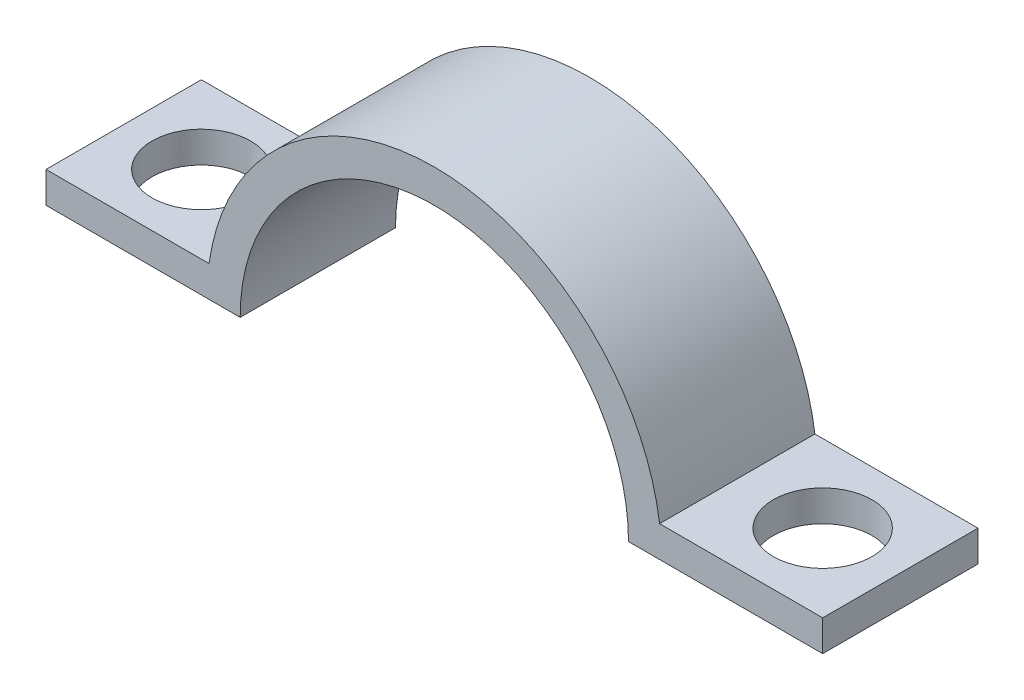
ISO-10303-21;
HEADER;
FILE_DESCRIPTION(('STEP AP214'),'2;1');
FILE_NAME('part.step','',(''),(''),'','','');
FILE_SCHEMA(('AUTOMOTIVE_DESIGN { 1 0 10303 214 1 1 1 1 }'));
ENDSEC;
DATA;
#1=APPLICATION_CONTEXT('core data for automotive mechanical design processes');
#2=APPLICATION_PROTOCOL_DEFINITION('international standard','automotive_design',2000,#1);
#3=PRODUCT_CONTEXT('',#1,'mechanical');
#4=PRODUCT('Part','Part','',(#3));
#5=PRODUCT_RELATED_PRODUCT_CATEGORY('part','',(#4));
#6=PRODUCT_DEFINITION_FORMATION('','',#4);
#7=PRODUCT_DEFINITION_CONTEXT('part definition',#1,'design');
#8=PRODUCT_DEFINITION('design','',#6,#7);
#9=PRODUCT_DEFINITION_SHAPE('','',#8);
#10=(LENGTH_UNIT() NAMED_UNIT(*) SI_UNIT(.MILLI.,.METRE.));
#11=(NAMED_UNIT(*) PLANE_ANGLE_UNIT() SI_UNIT($,.RADIAN.));
#12=(NAMED_UNIT(*) SI_UNIT($,.STERADIAN.) SOLID_ANGLE_UNIT());
#13=UNCERTAINTY_MEASURE_WITH_UNIT(LENGTH_MEASURE(1.E-05),#10,'distance_accuracy_value','');
#14=(GEOMETRIC_REPRESENTATION_CONTEXT(3) GLOBAL_UNCERTAINTY_ASSIGNED_CONTEXT((#13)) GLOBAL_UNIT_ASSIGNED_CONTEXT((#10,
#11,#12)) REPRESENTATION_CONTEXT('',''));
#15=CARTESIAN_POINT('',(0.,0.,0.));
#16=DIRECTION('',(0.,0.,1.));
#17=DIRECTION('',(1.,0.,0.));
#18=AXIS2_PLACEMENT_3D('',#15,#16,#17);
#19=CARTESIAN_POINT('',(-66.7458652227116,0.,40.));
#20=DIRECTION('',(0.,1.,0.));
#21=DIRECTION('',(0.,0.,1.));
#22=AXIS2_PLACEMENT_3D('',#19,#20,#21);
#23=PLANE('',#22);
#24=CARTESIAN_POINT('',(-46.7458652227116,0.,20.));
#25=DIRECTION('',(0.,1.,0.));
#26=DIRECTION('',(0.,0.,1.));
#27=AXIS2_PLACEMENT_3D('',#24,#25,#26);
#28=CIRCLE('',#27,12.7);
#29=CARTESIAN_POINT('',(-46.7458652227116,0.,32.7));
#30=VERTEX_POINT('',#29);
#31=EDGE_CURVE('E185',#30,#30,#28,.T.);
#32=ORIENTED_EDGE('',*,*,#31,.T.);
#33=EDGE_LOOP('',(#32));
#34=FACE_BOUND('',#33,.T.);
#35=DIRECTION('',(1.,0.,0.));
#36=VECTOR('',#35,1.);
#37=CARTESIAN_POINT('',(-66.7458652227116,0.,0.));
#38=LINE('',#37,#36);
#39=CARTESIAN_POINT('',(-66.7458652227116,0.,0.));
#40=VERTEX_POINT('',#39);
#41=CARTESIAN_POINT('',(-16.7458652227117,0.,0.));
#42=VERTEX_POINT('',#41);
#43=EDGE_CURVE('E135',#40,#42,#38,.T.);
#44=ORIENTED_EDGE('',*,*,#43,.T.);
#45=DIRECTION('',(0.,0.,-1.));
#46=VECTOR('',#45,1.);
#47=CARTESIAN_POINT('',(-16.7458652227117,0.,40.));
#48=LINE('',#47,#46);
#49=CARTESIAN_POINT('',(-16.7458652227117,0.,40.));
#50=VERTEX_POINT('',#49);
#51=EDGE_CURVE('E11',#50,#42,#48,.T.);
#52=ORIENTED_EDGE('',*,*,#51,.F.);
#53=DIRECTION('',(1.,0.,0.));
#54=VECTOR('',#53,1.);
#55=CARTESIAN_POINT('',(-66.7458652227116,0.,40.));
#56=LINE('',#55,#54);
#57=CARTESIAN_POINT('',(-66.7458652227116,0.,40.));
#58=VERTEX_POINT('',#57);
#59=EDGE_CURVE('E150',#58,#50,#56,.T.);
#60=ORIENTED_EDGE('',*,*,#59,.F.);
#61=DIRECTION('',(0.,0.,-1.));
#62=VECTOR('',#61,1.);
#63=CARTESIAN_POINT('',(-66.7458652227116,0.,40.));
#64=LINE('',#63,#62);
#65=EDGE_CURVE('E131',#58,#40,#64,.T.);
#66=ORIENTED_EDGE('',*,*,#65,.T.);
#67=EDGE_LOOP('',(#44,#52,#60,#66));
#68=FACE_BOUND('',#67,.T.);
#69=ADVANCED_FACE('F39',(#34,#68),#23,.F.);
#70=CARTESIAN_POINT('',(33.2541347772884,0.,40.));
#71=DIRECTION('',(0.,0.,-1.));
#72=DIRECTION('',(-1.,0.,0.));
#73=AXIS2_PLACEMENT_3D('',#70,#71,#72);
#74=CYLINDRICAL_SURFACE('',#73,50.);
#75=CARTESIAN_POINT('',(33.2541347772884,0.,0.));
#76=DIRECTION('',(0.,0.,-1.));
#77=DIRECTION('',(1.,0.,0.));
#78=AXIS2_PLACEMENT_3D('',#75,#76,#77);
#79=CIRCLE('',#78,50.);
#80=CARTESIAN_POINT('',(83.2541347772884,0.,0.));
#81=VERTEX_POINT('',#80);
#82=EDGE_CURVE('E138',#42,#81,#79,.T.);
#83=ORIENTED_EDGE('',*,*,#82,.T.);
#84=DIRECTION('',(0.,0.,-1.));
#85=VECTOR('',#84,1.);
#86=CARTESIAN_POINT('',(83.2541347772884,0.,40.));
#87=LINE('',#86,#85);
#88=CARTESIAN_POINT('',(83.2541347772884,0.,40.));
#89=VERTEX_POINT('',#88);
#90=EDGE_CURVE('E47',#89,#81,#87,.T.);
#91=ORIENTED_EDGE('',*,*,#90,.F.);
#92=CARTESIAN_POINT('',(33.2541347772884,0.,40.));
#93=DIRECTION('',(0.,0.,-1.));
#94=DIRECTION('',(1.,0.,0.));
#95=AXIS2_PLACEMENT_3D('',#92,#93,#94);
#96=CIRCLE('',#95,50.);
#97=EDGE_CURVE('E98',#50,#89,#96,.T.);
#98=ORIENTED_EDGE('',*,*,#97,.F.);
#99=ORIENTED_EDGE('',*,*,#51,.T.);
#100=EDGE_LOOP('',(#83,#91,#98,#99));
#101=FACE_BOUND('',#100,.T.);
#102=ADVANCED_FACE('F208',(#101),#74,.F.);
#103=CARTESIAN_POINT('',(83.2541347772884,0.,40.));
#104=DIRECTION('',(0.,1.,0.));
#105=DIRECTION('',(0.,0.,1.));
#106=AXIS2_PLACEMENT_3D('',#103,#104,#105);
#107=PLANE('',#106);
#108=CARTESIAN_POINT('',(113.254134777288,0.,20.));
#109=DIRECTION('',(0.,1.,0.));
#110=DIRECTION('',(0.,0.,1.));
#111=AXIS2_PLACEMENT_3D('',#108,#109,#110);
#112=CIRCLE('',#111,12.7);
#113=CARTESIAN_POINT('',(113.254134777288,0.,32.7));
#114=VERTEX_POINT('',#113);
#115=EDGE_CURVE('E139',#114,#114,#112,.T.);
#116=ORIENTED_EDGE('',*,*,#115,.T.);
#117=EDGE_LOOP('',(#116));
#118=FACE_BOUND('',#117,.T.);
#119=DIRECTION('',(1.,0.,0.));
#120=VECTOR('',#119,1.);
#121=CARTESIAN_POINT('',(83.2541347772884,0.,0.));
#122=LINE('',#121,#120);
#123=CARTESIAN_POINT('',(133.254134777288,0.,0.));
#124=VERTEX_POINT('',#123);
#125=EDGE_CURVE('E141',#81,#124,#122,.T.);
#126=ORIENTED_EDGE('',*,*,#125,.T.);
#127=DIRECTION('',(0.,0.,-1.));
#128=VECTOR('',#127,1.);
#129=CARTESIAN_POINT('',(133.254134777288,0.,40.));
#130=LINE('',#129,#128);
#131=CARTESIAN_POINT('',(133.254134777288,0.,40.));
#132=VERTEX_POINT('',#131);
#133=EDGE_CURVE('E157',#132,#124,#130,.T.);
#134=ORIENTED_EDGE('',*,*,#133,.F.);
#135=DIRECTION('',(1.,0.,0.));
#136=VECTOR('',#135,1.);
#137=CARTESIAN_POINT('',(83.2541347772884,0.,40.));
#138=LINE('',#137,#136);
#139=EDGE_CURVE('E165',#89,#132,#138,.T.);
#140=ORIENTED_EDGE('',*,*,#139,.F.);
#141=ORIENTED_EDGE('',*,*,#90,.T.);
#142=EDGE_LOOP('',(#126,#134,#140,#141));
#143=FACE_BOUND('',#142,.T.);
#144=ADVANCED_FACE('F163',(#118,#143),#107,.F.);
#145=CARTESIAN_POINT('',(133.254134777288,0.,40.));
#146=DIRECTION('',(-1.,0.,0.));
#147=DIRECTION('',(0.,0.,1.));
#148=AXIS2_PLACEMENT_3D('',#145,#146,#147);
#149=PLANE('',#148);
#150=DIRECTION('',(0.,1.,0.));
#151=VECTOR('',#150,1.);
#152=CARTESIAN_POINT('',(133.254134777288,0.,0.));
#153=LINE('',#152,#151);
#154=CARTESIAN_POINT('',(133.254134777288,8.,0.));
#155=VERTEX_POINT('',#154);
#156=EDGE_CURVE('E143',#124,#155,#153,.T.);
#157=ORIENTED_EDGE('',*,*,#156,.T.);
#158=DIRECTION('',(0.,0.,-1.));
#159=VECTOR('',#158,1.);
#160=CARTESIAN_POINT('',(133.254134777288,8.,40.));
#161=LINE('',#160,#159);
#162=CARTESIAN_POINT('',(133.254134777288,8.,40.));
#163=VERTEX_POINT('',#162);
#164=EDGE_CURVE('E154',#163,#155,#161,.T.);
#165=ORIENTED_EDGE('',*,*,#164,.F.);
#166=DIRECTION('',(0.,1.,0.));
#167=VECTOR('',#166,1.);
#168=CARTESIAN_POINT('',(133.254134777288,0.,40.));
#169=LINE('',#168,#167);
#170=EDGE_CURVE('E177',#132,#163,#169,.T.);
#171=ORIENTED_EDGE('',*,*,#170,.F.);
#172=ORIENTED_EDGE('',*,*,#133,.T.);
#173=EDGE_LOOP('',(#157,#165,#171,#172));
#174=FACE_BOUND('',#173,.T.);
#175=ADVANCED_FACE('F173',(#174),#149,.F.);
#176=CARTESIAN_POINT('',(133.254134777288,8.,40.));
#177=DIRECTION('',(0.,-1.,0.));
#178=DIRECTION('',(0.,0.,-1.));
#179=AXIS2_PLACEMENT_3D('',#176,#177,#178);
#180=PLANE('',#179);
#181=CARTESIAN_POINT('',(113.254134777288,7.99999999999999,20.));
#182=DIRECTION('',(0.,1.,0.));
#183=DIRECTION('',(-1.,0.,0.));
#184=AXIS2_PLACEMENT_3D('',#181,#182,#183);
#185=CIRCLE('',#184,12.7);
#186=CARTESIAN_POINT('',(100.554134777288,7.99999999999999,20.));
#187=VERTEX_POINT('',#186);
#188=EDGE_CURVE('E189',#187,#187,#185,.T.);
#189=ORIENTED_EDGE('',*,*,#188,.F.);
#190=EDGE_LOOP('',(#189));
#191=FACE_BOUND('',#190,.T.);
#192=DIRECTION('',(-1.,0.,0.));
#193=VECTOR('',#192,1.);
#194=CARTESIAN_POINT('',(133.254134777288,8.,0.));
#195=LINE('',#194,#193);
#196=CARTESIAN_POINT('',(91.2541347772884,8.,0.));
#197=VERTEX_POINT('',#196);
#198=EDGE_CURVE('E145',#155,#197,#195,.T.);
#199=ORIENTED_EDGE('',*,*,#198,.T.);
#200=DIRECTION('',(0.,0.,-1.));
#201=VECTOR('',#200,1.);
#202=CARTESIAN_POINT('',(91.2541347772884,8.,40.));
#203=LINE('',#202,#201);
#204=CARTESIAN_POINT('',(91.2541347772884,8.,40.));
#205=VERTEX_POINT('',#204);
#206=EDGE_CURVE('E126',#205,#197,#203,.T.);
#207=ORIENTED_EDGE('',*,*,#206,.F.);
#208=DIRECTION('',(-1.,0.,0.));
#209=VECTOR('',#208,1.);
#210=CARTESIAN_POINT('',(133.254134777288,8.,40.));
#211=LINE('',#210,#209);
#212=EDGE_CURVE('E117',#163,#205,#211,.T.);
#213=ORIENTED_EDGE('',*,*,#212,.F.);
#214=ORIENTED_EDGE('',*,*,#164,.T.);
#215=EDGE_LOOP('',(#199,#207,#213,#214));
#216=FACE_BOUND('',#215,.T.);
#217=ADVANCED_FACE('F176',(#191,#216),#180,.F.);
#218=CARTESIAN_POINT('',(33.2541347772884,0.,40.));
#219=DIRECTION('',(0.,0.,-1.));
#220=DIRECTION('',(-1.,0.,0.));
#221=AXIS2_PLACEMENT_3D('',#218,#219,#220);
#222=CYLINDRICAL_SURFACE('',#221,58.5491246732178);
#223=CARTESIAN_POINT('',(33.2541347772884,0.,0.));
#224=DIRECTION('',(0.,0.,1.));
#225=DIRECTION('',(1.,0.,0.));
#226=AXIS2_PLACEMENT_3D('',#223,#224,#225);
#227=CIRCLE('',#226,58.5491246732178);
#228=CARTESIAN_POINT('',(-24.7458652227116,8.,0.));
#229=VERTEX_POINT('',#228);
#230=EDGE_CURVE('E125',#197,#229,#227,.T.);
#231=ORIENTED_EDGE('',*,*,#230,.T.);
#232=DIRECTION('',(0.,0.,-1.));
#233=VECTOR('',#232,1.);
#234=CARTESIAN_POINT('',(-24.7458652227116,8.,40.));
#235=LINE('',#234,#233);
#236=CARTESIAN_POINT('',(-24.7458652227116,8.,40.));
#237=VERTEX_POINT('',#236);
#238=EDGE_CURVE('E122',#237,#229,#235,.T.);
#239=ORIENTED_EDGE('',*,*,#238,.F.);
#240=CARTESIAN_POINT('',(33.2541347772884,0.,40.));
#241=DIRECTION('',(0.,0.,1.));
#242=DIRECTION('',(1.,0.,0.));
#243=AXIS2_PLACEMENT_3D('',#240,#241,#242);
#244=CIRCLE('',#243,58.5491246732178);
#245=EDGE_CURVE('E111',#205,#237,#244,.T.);
#246=ORIENTED_EDGE('',*,*,#245,.F.);
#247=ORIENTED_EDGE('',*,*,#206,.T.);
#248=EDGE_LOOP('',(#231,#239,#246,#247));
#249=FACE_BOUND('',#248,.T.);
#250=ADVANCED_FACE('F123',(#249),#222,.T.);
#251=CARTESIAN_POINT('',(-66.7458652227116,8.,40.));
#252=DIRECTION('',(0.,-1.,0.));
#253=DIRECTION('',(1.,0.,0.));
#254=AXIS2_PLACEMENT_3D('',#251,#252,#253);
#255=PLANE('',#254);
#256=CARTESIAN_POINT('',(-46.7458652227116,8.,20.));
#257=DIRECTION('',(0.,1.,0.));
#258=DIRECTION('',(-1.,0.,0.));
#259=AXIS2_PLACEMENT_3D('',#256,#257,#258);
#260=CIRCLE('',#259,12.7);
#261=CARTESIAN_POINT('',(-59.4458652227116,8.,20.));
#262=VERTEX_POINT('',#261);
#263=EDGE_CURVE('E188',#262,#262,#260,.T.);
#264=ORIENTED_EDGE('',*,*,#263,.F.);
#265=EDGE_LOOP('',(#264));
#266=FACE_BOUND('',#265,.T.);
#267=DIRECTION('',(-1.,0.,0.));
#268=VECTOR('',#267,1.);
#269=CARTESIAN_POINT('',(-66.7458652227116,8.,0.));
#270=LINE('',#269,#268);
#271=CARTESIAN_POINT('',(-66.7458652227116,8.,0.));
#272=VERTEX_POINT('',#271);
#273=EDGE_CURVE('E84',#229,#272,#270,.T.);
#274=ORIENTED_EDGE('',*,*,#273,.T.);
#275=DIRECTION('',(0.,0.,-1.));
#276=VECTOR('',#275,1.);
#277=CARTESIAN_POINT('',(-66.7458652227116,8.,40.));
#278=LINE('',#277,#276);
#279=CARTESIAN_POINT('',(-66.7458652227116,8.,40.));
#280=VERTEX_POINT('',#279);
#281=EDGE_CURVE('E127',#280,#272,#278,.T.);
#282=ORIENTED_EDGE('',*,*,#281,.F.);
#283=DIRECTION('',(-1.,0.,0.));
#284=VECTOR('',#283,1.);
#285=CARTESIAN_POINT('',(-66.7458652227116,8.,40.));
#286=LINE('',#285,#284);
#287=EDGE_CURVE('E115',#237,#280,#286,.T.);
#288=ORIENTED_EDGE('',*,*,#287,.F.);
#289=ORIENTED_EDGE('',*,*,#238,.T.);
#290=EDGE_LOOP('',(#274,#282,#288,#289));
#291=FACE_BOUND('',#290,.T.);
#292=ADVANCED_FACE('F129',(#266,#291),#255,.F.);
#293=CARTESIAN_POINT('',(-66.7458652227116,0.,40.));
#294=DIRECTION('',(1.,0.,0.));
#295=DIRECTION('',(0.,0.,-1.));
#296=AXIS2_PLACEMENT_3D('',#293,#294,#295);
#297=PLANE('',#296);
#298=DIRECTION('',(0.,-1.,0.));
#299=VECTOR('',#298,1.);
#300=CARTESIAN_POINT('',(-66.7458652227116,0.,0.));
#301=LINE('',#300,#299);
#302=EDGE_CURVE('E90',#272,#40,#301,.T.);
#303=ORIENTED_EDGE('',*,*,#302,.T.);
#304=ORIENTED_EDGE('',*,*,#65,.F.);
#305=DIRECTION('',(0.,-1.,0.));
#306=VECTOR('',#305,1.);
#307=CARTESIAN_POINT('',(-66.7458652227116,0.,40.));
#308=LINE('',#307,#306);
#309=EDGE_CURVE('E55',#280,#58,#308,.T.);
#310=ORIENTED_EDGE('',*,*,#309,.F.);
#311=ORIENTED_EDGE('',*,*,#281,.T.);
#312=EDGE_LOOP('',(#303,#304,#310,#311));
#313=FACE_BOUND('',#312,.T.);
#314=ADVANCED_FACE('F199',(#313),#297,.F.);
#315=CARTESIAN_POINT('',(33.2541347772884,0.,40.));
#316=DIRECTION('',(0.,0.,1.));
#317=DIRECTION('',(1.,0.,0.));
#318=AXIS2_PLACEMENT_3D('',#315,#316,#317);
#319=PLANE('',#318);
#320=ORIENTED_EDGE('',*,*,#59,.T.);
#321=ORIENTED_EDGE('',*,*,#97,.T.);
#322=ORIENTED_EDGE('',*,*,#139,.T.);
#323=ORIENTED_EDGE('',*,*,#170,.T.);
#324=ORIENTED_EDGE('',*,*,#212,.T.);
#325=ORIENTED_EDGE('',*,*,#245,.T.);
#326=ORIENTED_EDGE('',*,*,#287,.T.);
#327=ORIENTED_EDGE('',*,*,#309,.T.);
#328=EDGE_LOOP('',(#320,#321,#322,#323,#324,#325,#326,#327));
#329=FACE_BOUND('',#328,.T.);
#330=ADVANCED_FACE('F113',(#329),#319,.T.);
#331=CARTESIAN_POINT('',(33.2541347772884,0.,0.));
#332=DIRECTION('',(0.,0.,1.));
#333=DIRECTION('',(1.,0.,0.));
#334=AXIS2_PLACEMENT_3D('',#331,#332,#333);
#335=PLANE('',#334);
#336=ORIENTED_EDGE('',*,*,#43,.F.);
#337=ORIENTED_EDGE('',*,*,#302,.F.);
#338=ORIENTED_EDGE('',*,*,#273,.F.);
#339=ORIENTED_EDGE('',*,*,#230,.F.);
#340=ORIENTED_EDGE('',*,*,#198,.F.);
#341=ORIENTED_EDGE('',*,*,#156,.F.);
#342=ORIENTED_EDGE('',*,*,#125,.F.);
#343=ORIENTED_EDGE('',*,*,#82,.F.);
#344=EDGE_LOOP('',(#336,#337,#338,#339,#340,#341,#342,#343));
#345=FACE_BOUND('',#344,.T.);
#346=ADVANCED_FACE('F169',(#345),#335,.F.);
#347=CARTESIAN_POINT('',(-46.7458652227116,-32.,20.));
#348=DIRECTION('',(0.,1.,0.));
#349=DIRECTION('',(-1.,0.,0.));
#350=AXIS2_PLACEMENT_3D('',#347,#348,#349);
#351=CYLINDRICAL_SURFACE('',#350,12.7);
#352=ORIENTED_EDGE('',*,*,#263,.T.);
#353=EDGE_LOOP('',(#352));
#354=FACE_BOUND('',#353,.T.);
#355=ORIENTED_EDGE('',*,*,#31,.F.);
#356=EDGE_LOOP('',(#355));
#357=FACE_BOUND('',#356,.T.);
#358=ADVANCED_FACE('F195',(#354,#357),#351,.F.);
#359=CARTESIAN_POINT('',(113.254134777288,-32.,20.));
#360=DIRECTION('',(0.,1.,0.));
#361=DIRECTION('',(-1.,0.,0.));
#362=AXIS2_PLACEMENT_3D('',#359,#360,#361);
#363=CYLINDRICAL_SURFACE('',#362,12.7);
#364=ORIENTED_EDGE('',*,*,#188,.T.);
#365=EDGE_LOOP('',(#364));
#366=FACE_BOUND('',#365,.T.);
#367=ORIENTED_EDGE('',*,*,#115,.F.);
#368=EDGE_LOOP('',(#367));
#369=FACE_BOUND('',#368,.T.);
#370=ADVANCED_FACE('F218',(#366,#369),#363,.F.);
#371=CLOSED_SHELL('',(#69,#102,#144,#175,#217,#250,#292,#314,#330,#346,#358,#370));
#372=MANIFOLD_SOLID_BREP('B2',#371);
#373=ADVANCED_BREP_SHAPE_REPRESENTATION('',(#18,#372),#14);
#374=SHAPE_DEFINITION_REPRESENTATION(#9,#373);
ENDSEC;
END-ISO-10303-21;
